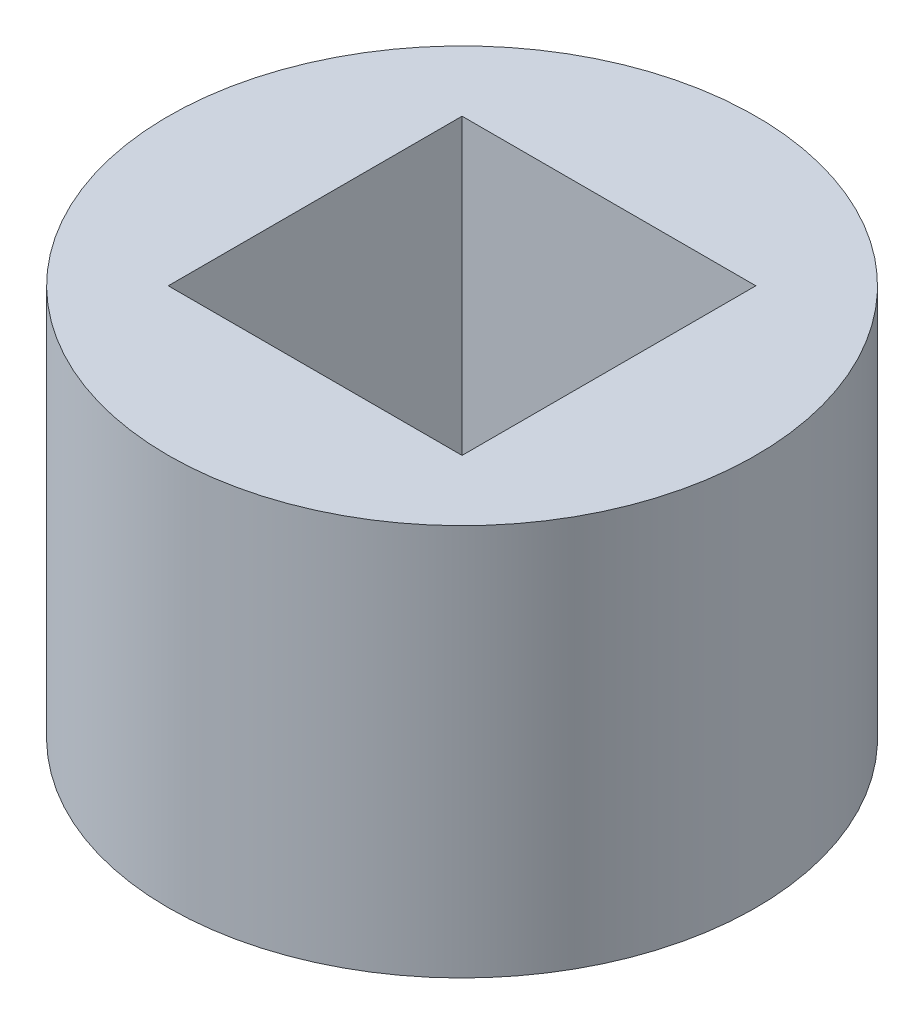
ISO-10303-21;
HEADER;
FILE_DESCRIPTION(('STEP AP214'),'2;1');
FILE_NAME('part.step','',(''),(''),'','','');
FILE_SCHEMA(('AUTOMOTIVE_DESIGN { 1 0 10303 214 1 1 1 1 }'));
ENDSEC;
DATA;
#1=APPLICATION_CONTEXT('core data for automotive mechanical design processes');
#2=APPLICATION_PROTOCOL_DEFINITION('international standard','automotive_design',2000,#1);
#3=PRODUCT_CONTEXT('',#1,'mechanical');
#4=PRODUCT('Part','Part','',(#3));
#5=PRODUCT_RELATED_PRODUCT_CATEGORY('part','',(#4));
#6=PRODUCT_DEFINITION_FORMATION('','',#4);
#7=PRODUCT_DEFINITION_CONTEXT('part definition',#1,'design');
#8=PRODUCT_DEFINITION('design','',#6,#7);
#9=PRODUCT_DEFINITION_SHAPE('','',#8);
#10=(LENGTH_UNIT() NAMED_UNIT(*) SI_UNIT(.MILLI.,.METRE.));
#11=(NAMED_UNIT(*) PLANE_ANGLE_UNIT() SI_UNIT($,.RADIAN.));
#12=(NAMED_UNIT(*) SI_UNIT($,.STERADIAN.) SOLID_ANGLE_UNIT());
#13=UNCERTAINTY_MEASURE_WITH_UNIT(LENGTH_MEASURE(1.E-05),#10,'distance_accuracy_value','');
#14=(GEOMETRIC_REPRESENTATION_CONTEXT(3) GLOBAL_UNCERTAINTY_ASSIGNED_CONTEXT((#13)) GLOBAL_UNIT_ASSIGNED_CONTEXT((#10,
#11,#12)) REPRESENTATION_CONTEXT('',''));
#15=CARTESIAN_POINT('',(0.,0.,0.));
#16=DIRECTION('',(0.,0.,1.));
#17=DIRECTION('',(1.,0.,0.));
#18=AXIS2_PLACEMENT_3D('',#15,#16,#17);
#19=CARTESIAN_POINT('',(0.,20.,0.));
#20=DIRECTION('',(0.,1.,0.));
#21=DIRECTION('',(0.,0.,1.));
#22=AXIS2_PLACEMENT_3D('',#19,#20,#21);
#23=PLANE('',#22);
#24=CARTESIAN_POINT('',(0.,20.,0.));
#25=DIRECTION('',(0.,1.,0.));
#26=DIRECTION('',(0.,0.,1.));
#27=AXIS2_PLACEMENT_3D('',#24,#25,#26);
#28=CIRCLE('',#27,15.);
#29=CARTESIAN_POINT('',(0.,20.,15.));
#30=VERTEX_POINT('',#29);
#31=EDGE_CURVE('E11',#30,#30,#28,.T.);
#32=ORIENTED_EDGE('',*,*,#31,.T.);
#33=EDGE_LOOP('',(#32));
#34=FACE_BOUND('',#33,.T.);
#35=DIRECTION('',(-1.,0.,0.));
#36=VECTOR('',#35,1.);
#37=CARTESIAN_POINT('',(-7.5,20.,-7.5));
#38=LINE('',#37,#36);
#39=CARTESIAN_POINT('',(7.5,20.,-7.5));
#40=VERTEX_POINT('',#39);
#41=CARTESIAN_POINT('',(-7.5,20.,-7.5));
#42=VERTEX_POINT('',#41);
#43=EDGE_CURVE('E86',#40,#42,#38,.T.);
#44=ORIENTED_EDGE('',*,*,#43,.F.);
#45=DIRECTION('',(0.,0.,-1.));
#46=VECTOR('',#45,1.);
#47=CARTESIAN_POINT('',(7.5,20.,-7.5));
#48=LINE('',#47,#46);
#49=CARTESIAN_POINT('',(7.5,20.,7.5));
#50=VERTEX_POINT('',#49);
#51=EDGE_CURVE('E78',#50,#40,#48,.T.);
#52=ORIENTED_EDGE('',*,*,#51,.F.);
#53=DIRECTION('',(1.,0.,0.));
#54=VECTOR('',#53,1.);
#55=CARTESIAN_POINT('',(-7.5,20.,7.5));
#56=LINE('',#55,#54);
#57=CARTESIAN_POINT('',(-7.5,20.,7.5));
#58=VERTEX_POINT('',#57);
#59=EDGE_CURVE('E99',#58,#50,#56,.T.);
#60=ORIENTED_EDGE('',*,*,#59,.F.);
#61=DIRECTION('',(0.,0.,1.));
#62=VECTOR('',#61,1.);
#63=CARTESIAN_POINT('',(-7.5,20.,-7.5));
#64=LINE('',#63,#62);
#65=EDGE_CURVE('E97',#42,#58,#64,.T.);
#66=ORIENTED_EDGE('',*,*,#65,.F.);
#67=EDGE_LOOP('',(#44,#52,#60,#66));
#68=FACE_BOUND('',#67,.T.);
#69=ADVANCED_FACE('F37',(#34,#68),#23,.T.);
#70=CARTESIAN_POINT('',(0.,0.,0.));
#71=DIRECTION('',(0.,1.,0.));
#72=DIRECTION('',(0.,0.,1.));
#73=AXIS2_PLACEMENT_3D('',#70,#71,#72);
#74=PLANE('',#73);
#75=CARTESIAN_POINT('',(0.,0.,0.));
#76=DIRECTION('',(0.,1.,0.));
#77=DIRECTION('',(0.,0.,1.));
#78=AXIS2_PLACEMENT_3D('',#75,#76,#77);
#79=CIRCLE('',#78,15.);
#80=CARTESIAN_POINT('',(0.,0.,15.));
#81=VERTEX_POINT('',#80);
#82=EDGE_CURVE('E41',#81,#81,#79,.T.);
#83=ORIENTED_EDGE('',*,*,#82,.F.);
#84=EDGE_LOOP('',(#83));
#85=FACE_BOUND('',#84,.T.);
#86=DIRECTION('',(0.,0.,-1.));
#87=VECTOR('',#86,1.);
#88=CARTESIAN_POINT('',(7.5,0.,-7.5));
#89=LINE('',#88,#87);
#90=CARTESIAN_POINT('',(7.5,0.,7.5));
#91=VERTEX_POINT('',#90);
#92=CARTESIAN_POINT('',(7.5,0.,-7.5));
#93=VERTEX_POINT('',#92);
#94=EDGE_CURVE('E60',#91,#93,#89,.T.);
#95=ORIENTED_EDGE('',*,*,#94,.T.);
#96=DIRECTION('',(-1.,0.,0.));
#97=VECTOR('',#96,1.);
#98=CARTESIAN_POINT('',(-7.5,0.,-7.5));
#99=LINE('',#98,#97);
#100=CARTESIAN_POINT('',(-7.5,0.,-7.5));
#101=VERTEX_POINT('',#100);
#102=EDGE_CURVE('E93',#93,#101,#99,.T.);
#103=ORIENTED_EDGE('',*,*,#102,.T.);
#104=DIRECTION('',(0.,0.,1.));
#105=VECTOR('',#104,1.);
#106=CARTESIAN_POINT('',(-7.5,0.,-7.5));
#107=LINE('',#106,#105);
#108=CARTESIAN_POINT('',(-7.5,0.,7.5));
#109=VERTEX_POINT('',#108);
#110=EDGE_CURVE('E105',#101,#109,#107,.T.);
#111=ORIENTED_EDGE('',*,*,#110,.T.);
#112=DIRECTION('',(1.,0.,0.));
#113=VECTOR('',#112,1.);
#114=CARTESIAN_POINT('',(-7.5,0.,7.5));
#115=LINE('',#114,#113);
#116=EDGE_CURVE('E87',#109,#91,#115,.T.);
#117=ORIENTED_EDGE('',*,*,#116,.T.);
#118=EDGE_LOOP('',(#95,#103,#111,#117));
#119=FACE_BOUND('',#118,.T.);
#120=ADVANCED_FACE('F116',(#85,#119),#74,.F.);
#121=CARTESIAN_POINT('',(0.,20.,0.));
#122=DIRECTION('',(0.,-1.,0.));
#123=DIRECTION('',(0.,0.,-1.));
#124=AXIS2_PLACEMENT_3D('',#121,#122,#123);
#125=CYLINDRICAL_SURFACE('',#124,15.);
#126=ORIENTED_EDGE('',*,*,#31,.F.);
#127=EDGE_LOOP('',(#126));
#128=FACE_BOUND('',#127,.T.);
#129=ORIENTED_EDGE('',*,*,#82,.T.);
#130=EDGE_LOOP('',(#129));
#131=FACE_BOUND('',#130,.T.);
#132=ADVANCED_FACE('F39',(#128,#131),#125,.T.);
#133=CARTESIAN_POINT('',(7.5,20.,-7.5));
#134=DIRECTION('',(-1.,0.,0.));
#135=DIRECTION('',(0.,0.,1.));
#136=AXIS2_PLACEMENT_3D('',#133,#134,#135);
#137=PLANE('',#136);
#138=ORIENTED_EDGE('',*,*,#94,.F.);
#139=DIRECTION('',(0.,-1.,0.));
#140=VECTOR('',#139,1.);
#141=CARTESIAN_POINT('',(7.5,20.,7.5));
#142=LINE('',#141,#140);
#143=EDGE_CURVE('E82',#50,#91,#142,.T.);
#144=ORIENTED_EDGE('',*,*,#143,.F.);
#145=ORIENTED_EDGE('',*,*,#51,.T.);
#146=DIRECTION('',(0.,-1.,0.));
#147=VECTOR('',#146,1.);
#148=CARTESIAN_POINT('',(7.5,20.,-7.5));
#149=LINE('',#148,#147);
#150=EDGE_CURVE('E81',#40,#93,#149,.T.);
#151=ORIENTED_EDGE('',*,*,#150,.T.);
#152=EDGE_LOOP('',(#138,#144,#145,#151));
#153=FACE_BOUND('',#152,.T.);
#154=ADVANCED_FACE('F80',(#153),#137,.T.);
#155=CARTESIAN_POINT('',(-7.5,20.,-7.5));
#156=DIRECTION('',(0.,0.,1.));
#157=DIRECTION('',(1.,0.,0.));
#158=AXIS2_PLACEMENT_3D('',#155,#156,#157);
#159=PLANE('',#158);
#160=ORIENTED_EDGE('',*,*,#102,.F.);
#161=ORIENTED_EDGE('',*,*,#150,.F.);
#162=ORIENTED_EDGE('',*,*,#43,.T.);
#163=DIRECTION('',(0.,-1.,0.));
#164=VECTOR('',#163,1.);
#165=CARTESIAN_POINT('',(-7.5,20.,-7.5));
#166=LINE('',#165,#164);
#167=EDGE_CURVE('E94',#42,#101,#166,.T.);
#168=ORIENTED_EDGE('',*,*,#167,.T.);
#169=EDGE_LOOP('',(#160,#161,#162,#168));
#170=FACE_BOUND('',#169,.T.);
#171=ADVANCED_FACE('F90',(#170),#159,.T.);
#172=CARTESIAN_POINT('',(-7.5,20.,-7.5));
#173=DIRECTION('',(1.,0.,0.));
#174=DIRECTION('',(0.,0.,-1.));
#175=AXIS2_PLACEMENT_3D('',#172,#173,#174);
#176=PLANE('',#175);
#177=ORIENTED_EDGE('',*,*,#110,.F.);
#178=ORIENTED_EDGE('',*,*,#167,.F.);
#179=ORIENTED_EDGE('',*,*,#65,.T.);
#180=DIRECTION('',(0.,-1.,0.));
#181=VECTOR('',#180,1.);
#182=CARTESIAN_POINT('',(-7.5,20.,7.5));
#183=LINE('',#182,#181);
#184=EDGE_CURVE('E52',#58,#109,#183,.T.);
#185=ORIENTED_EDGE('',*,*,#184,.T.);
#186=EDGE_LOOP('',(#177,#178,#179,#185));
#187=FACE_BOUND('',#186,.T.);
#188=ADVANCED_FACE('F114',(#187),#176,.T.);
#189=CARTESIAN_POINT('',(-7.5,20.,7.5));
#190=DIRECTION('',(0.,0.,-1.));
#191=DIRECTION('',(-1.,0.,0.));
#192=AXIS2_PLACEMENT_3D('',#189,#190,#191);
#193=PLANE('',#192);
#194=ORIENTED_EDGE('',*,*,#116,.F.);
#195=ORIENTED_EDGE('',*,*,#184,.F.);
#196=ORIENTED_EDGE('',*,*,#59,.T.);
#197=ORIENTED_EDGE('',*,*,#143,.T.);
#198=EDGE_LOOP('',(#194,#195,#196,#197));
#199=FACE_BOUND('',#198,.T.);
#200=ADVANCED_FACE('F117',(#199),#193,.T.);
#201=CLOSED_SHELL('',(#69,#120,#132,#154,#171,#188,#200));
#202=MANIFOLD_SOLID_BREP('B2',#201);
#203=ADVANCED_BREP_SHAPE_REPRESENTATION('',(#18,#202),#14);
#204=SHAPE_DEFINITION_REPRESENTATION(#9,#203);
ENDSEC;
END-ISO-10303-21;
